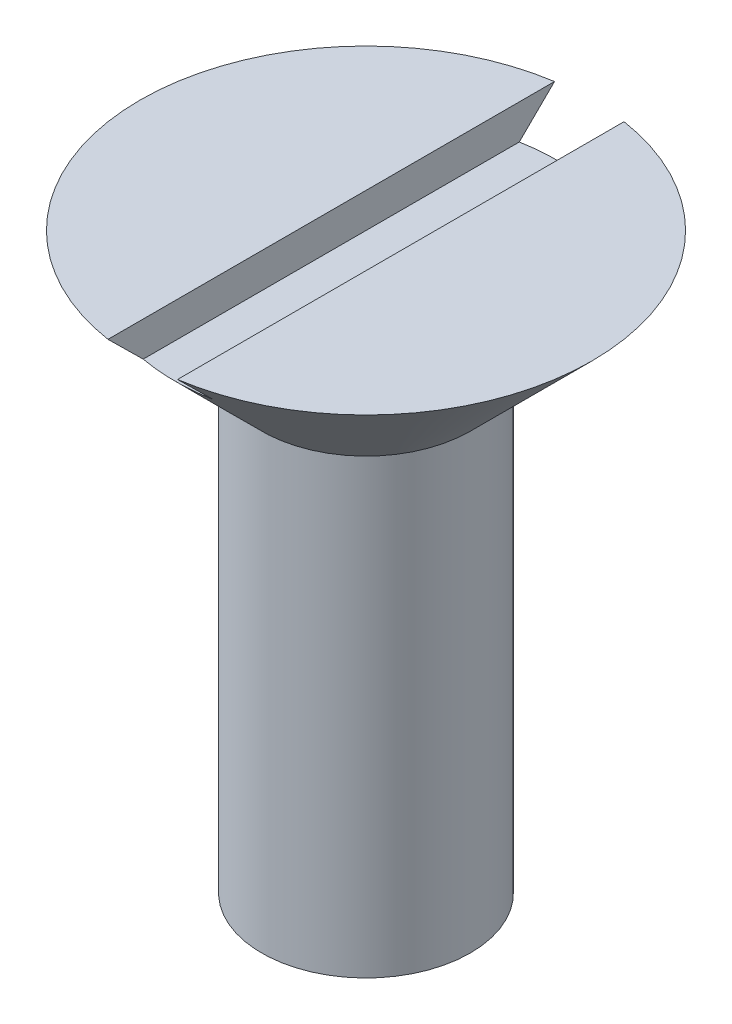
ISO-10303-21;
HEADER;
FILE_DESCRIPTION(('STEP AP214'),'2;1');
FILE_NAME('part.step','',(''),(''),'','','');
FILE_SCHEMA(('AUTOMOTIVE_DESIGN { 1 0 10303 214 1 1 1 1 }'));
ENDSEC;
DATA;
#1=APPLICATION_CONTEXT('core data for automotive mechanical design processes');
#2=APPLICATION_PROTOCOL_DEFINITION('international standard','automotive_design',2000,#1);
#3=PRODUCT_CONTEXT('',#1,'mechanical');
#4=PRODUCT('Part','Part','',(#3));
#5=PRODUCT_RELATED_PRODUCT_CATEGORY('part','',(#4));
#6=PRODUCT_DEFINITION_FORMATION('','',#4);
#7=PRODUCT_DEFINITION_CONTEXT('part definition',#1,'design');
#8=PRODUCT_DEFINITION('design','',#6,#7);
#9=PRODUCT_DEFINITION_SHAPE('','',#8);
#10=(LENGTH_UNIT() NAMED_UNIT(*) SI_UNIT(.MILLI.,.METRE.));
#11=(NAMED_UNIT(*) PLANE_ANGLE_UNIT() SI_UNIT($,.RADIAN.));
#12=(NAMED_UNIT(*) SI_UNIT($,.STERADIAN.) SOLID_ANGLE_UNIT());
#13=UNCERTAINTY_MEASURE_WITH_UNIT(LENGTH_MEASURE(1.E-05),#10,'distance_accuracy_value','');
#14=(GEOMETRIC_REPRESENTATION_CONTEXT(3) GLOBAL_UNCERTAINTY_ASSIGNED_CONTEXT((#13)) GLOBAL_UNIT_ASSIGNED_CONTEXT((#10,
#11,#12)) REPRESENTATION_CONTEXT('',''));
#15=CARTESIAN_POINT('',(0.,0.,0.));
#16=DIRECTION('',(0.,0.,1.));
#17=DIRECTION('',(1.,0.,0.));
#18=AXIS2_PLACEMENT_3D('',#15,#16,#17);
#19=CARTESIAN_POINT('',(0.,-1.23273041027252,0.));
#20=DIRECTION('',(0.,-1.,0.));
#21=DIRECTION('',(1.,0.,0.));
#22=AXIS2_PLACEMENT_3D('',#19,#20,#21);
#23=PLANE('',#22);
#24=CARTESIAN_POINT('',(0.,-1.23273041027252,0.));
#25=DIRECTION('',(0.,1.,0.));
#26=DIRECTION('',(-1.,0.,0.));
#27=AXIS2_PLACEMENT_3D('',#24,#25,#26);
#28=CIRCLE('',#27,6.5);
#29=CARTESIAN_POINT('',(1.,-1.23273041027252,6.42261628933256));
#30=VERTEX_POINT('',#29);
#31=CARTESIAN_POINT('',(1.,-1.23273041027252,-6.42261628933256));
#32=VERTEX_POINT('',#31);
#33=EDGE_CURVE('E139',#30,#32,#28,.T.);
#34=ORIENTED_EDGE('',*,*,#33,.T.);
#35=DIRECTION('',(0.,0.,1.));
#36=VECTOR('',#35,1.);
#37=CARTESIAN_POINT('',(1.,-1.23273041027252,0.));
#38=LINE('',#37,#36);
#39=EDGE_CURVE('E140',#32,#30,#38,.T.);
#40=ORIENTED_EDGE('',*,*,#39,.T.);
#41=EDGE_LOOP('',(#34,#40));
#42=FACE_BOUND('',#41,.T.);
#43=ADVANCED_FACE('F38',(#42),#23,.F.);
#44=CARTESIAN_POINT('',(0.,-19.4647812178413,0.));
#45=DIRECTION('',(0.,1.,0.));
#46=DIRECTION('',(-1.,0.,0.));
#47=AXIS2_PLACEMENT_3D('',#44,#45,#46);
#48=CONICAL_SURFACE('',#47,0.,1.0471975511966);
#49=CARTESIAN_POINT('',(0.,-17.7327304102725,0.));
#50=DIRECTION('',(0.,1.,0.));
#51=DIRECTION('',(-1.,0.,0.));
#52=AXIS2_PLACEMENT_3D('',#49,#50,#51);
#53=CIRCLE('',#52,3.);
#54=CARTESIAN_POINT('',(-3.,-17.7327304102725,0.));
#55=VERTEX_POINT('',#54);
#56=EDGE_CURVE('E144',#55,#55,#53,.T.);
#57=ORIENTED_EDGE('',*,*,#56,.F.);
#58=EDGE_LOOP('',(#57));
#59=FACE_BOUND('',#58,.T.);
#60=CARTESIAN_POINT('',(0.,-19.4647812178413,0.));
#61=VERTEX_POINT('',#60);
#62=VERTEX_LOOP('',#61);
#63=FACE_BOUND('',#62,.T.);
#64=ADVANCED_FACE('F40',(#59,#63),#48,.T.);
#65=CARTESIAN_POINT('',(0.,-1.23273041027252,0.));
#66=DIRECTION('',(0.,1.,0.));
#67=DIRECTION('',(-1.,0.,0.));
#68=AXIS2_PLACEMENT_3D('',#65,#66,#67);
#69=CYLINDRICAL_SURFACE('',#68,3.);
#70=CARTESIAN_POINT('',(0.,-4.73273041027248,0.));
#71=DIRECTION('',(0.,1.,0.));
#72=DIRECTION('',(-1.,0.,0.));
#73=AXIS2_PLACEMENT_3D('',#70,#71,#72);
#74=CIRCLE('',#73,3.);
#75=CARTESIAN_POINT('',(-3.,-4.73273041027248,0.));
#76=VERTEX_POINT('',#75);
#77=EDGE_CURVE('E142',#76,#76,#74,.T.);
#78=ORIENTED_EDGE('',*,*,#77,.F.);
#79=EDGE_LOOP('',(#78));
#80=FACE_BOUND('',#79,.T.);
#81=ORIENTED_EDGE('',*,*,#56,.T.);
#82=EDGE_LOOP('',(#81));
#83=FACE_BOUND('',#82,.T.);
#84=ADVANCED_FACE('F129',(#80,#83),#69,.T.);
#85=CARTESIAN_POINT('',(0.,-4.73273041027248,0.));
#86=DIRECTION('',(0.,1.,0.));
#87=DIRECTION('',(-1.,0.,0.));
#88=AXIS2_PLACEMENT_3D('',#85,#86,#87);
#89=CONICAL_SURFACE('',#88,3.,0.785398163397454);
#90=CARTESIAN_POINT('',(0.,-2.23273041027252,0.));
#91=DIRECTION('',(0.,-1.,0.));
#92=DIRECTION('',(1.,0.,0.));
#93=AXIS2_PLACEMENT_3D('',#90,#91,#92);
#94=CIRCLE('',#93,5.49999999999999);
#95=CARTESIAN_POINT('',(-1.,-2.23273041027252,-5.40832691319597));
#96=VERTEX_POINT('',#95);
#97=CARTESIAN_POINT('',(1.,-2.23273041027252,-5.40832691319597));
#98=VERTEX_POINT('',#97);
#99=EDGE_CURVE('E12',#96,#98,#94,.T.);
#100=ORIENTED_EDGE('',*,*,#99,.T.);
#101=CARTESIAN_POINT('',(1.,-1.23203041027252,6.42332472244709));
#102=CARTESIAN_POINT('',(1.,-1.41652290300337,6.23660097945427));
#103=CARTESIAN_POINT('',(1.,-1.60092767577466,6.04979042026792));
#104=CARTESIAN_POINT('',(1.,-1.96959774053552,5.67580075194415));
#105=CARTESIAN_POINT('',(1.,-2.15386287259467,5.48862148517341));
#106=CARTESIAN_POINT('',(1.,-2.52420929500072,5.11174427199789));
#107=CARTESIAN_POINT('',(1.,-2.71028664727953,4.92204245247595));
#108=CARTESIAN_POINT('',(1.,-3.08183888065866,4.54228085926048));
#109=CARTESIAN_POINT('',(1.,-3.26731406452049,4.35222138163071));
#110=CARTESIAN_POINT('',(1.,-3.71240463713502,3.89448779308014));
#111=CARTESIAN_POINT('',(1.,-3.97168834205481,3.62648996292632));
#112=CARTESIAN_POINT('',(1.,-4.3589862932474,3.22235847326328));
#113=CARTESIAN_POINT('',(1.,-4.48795598015954,3.08714155543484));
#114=CARTESIAN_POINT('',(1.,-4.74491391650076,2.81583986260068));
#115=CARTESIAN_POINT('',(1.,-4.87290239698009,2.67975530664802));
#116=CARTESIAN_POINT('',(1.,-5.12627373485783,2.40750996464743));
#117=CARTESIAN_POINT('',(1.,-5.25166973839294,2.27136147506034));
#118=CARTESIAN_POINT('',(1.,-5.43807896359134,2.06549251852143));
#119=CARTESIAN_POINT('',(1.,-5.4999636338604,1.99656195550247));
#120=CARTESIAN_POINT('',(1.,-5.62295105751671,1.85800765522077));
#121=CARTESIAN_POINT('',(1.,-5.68405382729665,1.78838393254485));
#122=CARTESIAN_POINT('',(1.,-5.80495538868522,1.6484994482769));
#123=CARTESIAN_POINT('',(1.,-5.86475843522965,1.57824237330105));
#124=CARTESIAN_POINT('',(1.,-5.98287992571606,1.43649465507043));
#125=CARTESIAN_POINT('',(1.,-6.04119851200688,1.36500413120582));
#126=CARTESIAN_POINT('',(1.,-6.15557355759967,1.22040224759312));
#127=CARTESIAN_POINT('',(1.,-6.21163324500897,1.14729345020522));
#128=CARTESIAN_POINT('',(1.,-6.32039900730695,0.998633654183092));
#129=CARTESIAN_POINT('',(1.,-6.37310711050668,0.923084175167162));
#130=CARTESIAN_POINT('',(1.,-6.43531671875435,0.826733268002374));
#131=CARTESIAN_POINT('',(1.,-6.44742412999684,0.807613449628495));
#132=CARTESIAN_POINT('',(1.,-6.47125047956801,0.769130032509394));
#133=CARTESIAN_POINT('',(1.,-6.48296936765064,0.749766402676425));
#134=CARTESIAN_POINT('',(1.,-6.51746454090023,0.691277443855427));
#135=CARTESIAN_POINT('',(1.,-6.53957805134024,0.651756012110397));
#136=CARTESIAN_POINT('',(1.,-6.58129772281274,0.57179583646021));
#137=CARTESIAN_POINT('',(1.,-6.60092246148191,0.531366913059408));
#138=CARTESIAN_POINT('',(1.,-6.63710892258034,0.449164527118054));
#139=CARTESIAN_POINT('',(1.,-6.65367157340716,0.407391476629303));
#140=CARTESIAN_POINT('',(1.,-6.68820449817153,0.306630339616175));
#141=CARTESIAN_POINT('',(1.,-6.70441608363833,0.24700670038358));
#142=CARTESIAN_POINT('',(1.,-6.72655912176547,0.125997310764444));
#143=CARTESIAN_POINT('',(1.,-6.73252824716476,0.06461886569502));
#144=CARTESIAN_POINT('',(1.,-6.73292292890544,-0.0584045004398529));
#145=CARTESIAN_POINT('',(1.,-6.72730632242692,-0.1200495772222));
#146=CARTESIAN_POINT('',(1.,-6.70572091595079,-0.241594604406596));
#147=CARTESIAN_POINT('',(1.,-6.68971691800243,-0.301487895031297));
#148=CARTESIAN_POINT('',(1.,-6.64848496634865,-0.423255248595611));
#149=CARTESIAN_POINT('',(1.,-6.6226217895104,-0.484904761598903));
#150=CARTESIAN_POINT('',(1.,-6.56495097472921,-0.605404375291112));
#151=CARTESIAN_POINT('',(1.,-6.53313194161959,-0.664248833759943));
#152=CARTESIAN_POINT('',(1.,-6.46533146994867,-0.780076722377074));
#153=CARTESIAN_POINT('',(1.,-6.42931904780031,-0.837041711978605));
#154=CARTESIAN_POINT('',(1.,-6.3733152044274,-0.921108655798651));
#155=CARTESIAN_POINT('',(1.,-6.35432481755244,-0.94888945147057));
#156=CARTESIAN_POINT('',(1.,-6.31578210479641,-1.00405791508456));
#157=CARTESIAN_POINT('',(1.,-6.29622979513275,-1.03144559433807));
#158=CARTESIAN_POINT('',(1.,-6.23320744697192,-1.11814350022168));
#159=CARTESIAN_POINT('',(1.,-6.1888574220853,-1.17681365371053));
#160=CARTESIAN_POINT('',(1.,-6.09859877903792,-1.29294612386859));
#161=CARTESIAN_POINT('',(1.,-6.05268992011472,-1.35040825171831));
#162=CARTESIAN_POINT('',(1.,-5.91325346599664,-1.52148386035261));
#163=CARTESIAN_POINT('',(1.,-5.81805623924538,-1.63373305297759));
#164=CARTESIAN_POINT('',(1.,-5.62499054006917,-1.85622604953625));
#165=CARTESIAN_POINT('',(1.,-5.5271176863933,-1.96646600221255));
#166=CARTESIAN_POINT('',(1.,-5.32980484484801,-2.18547633450575));
#167=CARTESIAN_POINT('',(1.,-5.23036530311115,-2.29424711666668));
#168=CARTESIAN_POINT('',(1.,-5.03076191019596,-2.51044729255318));
#169=CARTESIAN_POINT('',(1.,-4.93060158375438,-2.61787995144487));
#170=CARTESIAN_POINT('',(1.,-4.72953329045203,-2.83205668510772));
#171=CARTESIAN_POINT('',(1.,-4.62862527175303,-2.93880071115715));
#172=CARTESIAN_POINT('',(1.,-4.32529946596139,-3.25807348248427));
#173=CARTESIAN_POINT('',(1.,-4.12208877139924,-3.46984818145712));
#174=CARTESIAN_POINT('',(1.,-3.6961791900289,-3.91117980862671));
#175=CARTESIAN_POINT('',(1.,-3.47336750982194,-4.1406275516051));
#176=CARTESIAN_POINT('',(1.,-3.0267954831004,-4.59874114188873));
#177=CARTESIAN_POINT('',(1.,-2.80303485486957,-4.82740671438632));
#178=CARTESIAN_POINT('',(1.,-2.35491893435839,-5.28420548161051));
#179=CARTESIAN_POINT('',(1.,-2.13056357670853,-5.51233861215162));
#180=CARTESIAN_POINT('',(1.,-1.68152248668073,-5.96812929258627));
#181=CARTESIAN_POINT('',(1.,-1.45683688985977,-6.19578697599766));
#182=CARTESIAN_POINT('',(1.,-1.23203041027252,-6.42332472244709));
#183=B_SPLINE_CURVE_WITH_KNOTS('',3,(#101,#102,#103,#104,#105,#106,#107,#108,#109,#110,#111,
#112,#113,#114,#115,#116,#117,#118,#119,#120,#121,#122,#123,#124,#125,#126,#127,#128,#129,#130,
#131,#132,#133,#134,#135,#136,#137,#138,#139,#140,#141,#142,#143,#144,#145,#146,#147,#148,#149,
#150,#151,#152,#153,#154,#155,#156,#157,#158,#159,#160,#161,#162,#163,#164,#165,#166,#167,#168,
#169,#170,#171,#172,#173,#174,#175,#176,#177,#178,#179,#180,#181,#182),.UNSPECIFIED.,.F.,.F.,(4,
2,2,2,2,2,2,2,2,2,2,2,2,2,2,2,2,2,2,2,2,2,2,2,2,2,2,2,2,2,2,2,2,2,2,2,2,2,2,2,4),(0.,
0.787482879091082,1.57545946982072,2.37264371237516,3.16933207457059,4.2880067299783,
4.84858456810994,5.40902607813934,5.96429483881581,6.24219393443099,6.52008719426127,
6.79686319025389,7.07361254470392,7.3499512636095,7.6261211242439,7.69400967717522,
7.76190697586418,7.8977086128613,8.0324279907232,8.16710645565276,8.35176568840783,
8.53574425942201,8.72039354672398,8.90567181282051,9.10576489619661,9.30624479924503,
9.50831322811276,9.60926230610502,9.71020847356947,9.93080591781799,10.1514375897978,
10.5929016423222,11.0351379005565,11.4772504248661,11.9178874921873,12.3585554006098,
13.2390498022863,14.1985373102663,15.1583329960949,16.1182389566303,17.077823941592),.UNSPECIFIED.);
#184=EDGE_CURVE('E96',#98,#32,#183,.T.);
#185=ORIENTED_EDGE('',*,*,#184,.T.);
#186=ORIENTED_EDGE('',*,*,#33,.F.);
#187=CARTESIAN_POINT('',(1.,-2.23273041027252,5.40832691319597));
#188=VERTEX_POINT('',#187);
#189=EDGE_CURVE('E98',#30,#188,#183,.T.);
#190=ORIENTED_EDGE('',*,*,#189,.T.);
#191=CARTESIAN_POINT('',(-1.,-2.23273041027252,5.40832691319597));
#192=VERTEX_POINT('',#191);
#193=EDGE_CURVE('E42',#188,#192,#94,.T.);
#194=ORIENTED_EDGE('',*,*,#193,.T.);
#195=CARTESIAN_POINT('',(-1.,-1.23203041027252,-6.42332472244709));
#196=CARTESIAN_POINT('',(-1.,-1.41652290300337,-6.23660097945427));
#197=CARTESIAN_POINT('',(-1.,-1.60092767577466,-6.04979042026792));
#198=CARTESIAN_POINT('',(-1.,-1.96959774053551,-5.67580075194415));
#199=CARTESIAN_POINT('',(-1.,-2.15386287259466,-5.48862148517342));
#200=CARTESIAN_POINT('',(-1.,-2.52420929500072,-5.1117442719979));
#201=CARTESIAN_POINT('',(-1.,-2.71028664727952,-4.92204245247596));
#202=CARTESIAN_POINT('',(-1.,-3.08183888065865,-4.54228085926049));
#203=CARTESIAN_POINT('',(-1.,-3.26731406452048,-4.35222138163072));
#204=CARTESIAN_POINT('',(-1.,-3.71240463713501,-3.89448779308015));
#205=CARTESIAN_POINT('',(-1.,-3.9716883420548,-3.62648996292633));
#206=CARTESIAN_POINT('',(-1.,-4.35898629324739,-3.22235847326328));
#207=CARTESIAN_POINT('',(-1.,-4.48795598015954,-3.08714155543485));
#208=CARTESIAN_POINT('',(-1.,-4.74491391650075,-2.81583986260069));
#209=CARTESIAN_POINT('',(-1.,-4.87290239698008,-2.67975530664803));
#210=CARTESIAN_POINT('',(-1.,-5.12627373485783,-2.40750996464744));
#211=CARTESIAN_POINT('',(-1.,-5.25166973839293,-2.27136147506034));
#212=CARTESIAN_POINT('',(-1.,-5.43807896359134,-2.06549251852143));
#213=CARTESIAN_POINT('',(-1.,-5.4999636338604,-1.99656195550247));
#214=CARTESIAN_POINT('',(-1.,-5.6229510575167,-1.85800765522077));
#215=CARTESIAN_POINT('',(-1.,-5.68405382729665,-1.78838393254485));
#216=CARTESIAN_POINT('',(-1.,-5.80495538868522,-1.6484994482769));
#217=CARTESIAN_POINT('',(-1.,-5.86475843522966,-1.57824237330105));
#218=CARTESIAN_POINT('',(-1.,-5.98287992571606,-1.43649465507043));
#219=CARTESIAN_POINT('',(-1.,-6.04119851200688,-1.36500413120582));
#220=CARTESIAN_POINT('',(-1.,-6.15557355759967,-1.22040224759312));
#221=CARTESIAN_POINT('',(-1.,-6.21163324500897,-1.14729345020522));
#222=CARTESIAN_POINT('',(-1.,-6.32039900730696,-0.998633654183092));
#223=CARTESIAN_POINT('',(-1.,-6.37310711050668,-0.923084175167162));
#224=CARTESIAN_POINT('',(-1.,-6.43531671875435,-0.826733268002373));
#225=CARTESIAN_POINT('',(-1.,-6.44742412999684,-0.807613449628494));
#226=CARTESIAN_POINT('',(-1.,-6.47125047956801,-0.769130032509394));
#227=CARTESIAN_POINT('',(-1.,-6.48296936765064,-0.749766402676424));
#228=CARTESIAN_POINT('',(-1.,-6.51746454090023,-0.691277443855426));
#229=CARTESIAN_POINT('',(-1.,-6.53957805134024,-0.651756012110397));
#230=CARTESIAN_POINT('',(-1.,-6.58129772281274,-0.57179583646021));
#231=CARTESIAN_POINT('',(-1.,-6.60092246148191,-0.531366913059407));
#232=CARTESIAN_POINT('',(-1.,-6.63710892258034,-0.449164527118054));
#233=CARTESIAN_POINT('',(-1.,-6.65367157340716,-0.407391476629303));
#234=CARTESIAN_POINT('',(-1.,-6.68820449817153,-0.306630339616176));
#235=CARTESIAN_POINT('',(-1.,-6.70441608363833,-0.247006700383581));
#236=CARTESIAN_POINT('',(-1.,-6.72655912176547,-0.125997310764445));
#237=CARTESIAN_POINT('',(-1.,-6.73252824716476,-0.0646188656950203));
#238=CARTESIAN_POINT('',(-1.,-6.73292292890544,0.0584045004398536));
#239=CARTESIAN_POINT('',(-1.,-6.72730632242692,0.120049577222201));
#240=CARTESIAN_POINT('',(-1.,-6.70572091595079,0.241594604406597));
#241=CARTESIAN_POINT('',(-1.,-6.68971691800243,0.301487895031297));
#242=CARTESIAN_POINT('',(-1.,-6.64848496634865,0.42325524859561));
#243=CARTESIAN_POINT('',(-1.,-6.6226217895104,0.484904761598902));
#244=CARTESIAN_POINT('',(-1.,-6.56495097472921,0.60540437529111));
#245=CARTESIAN_POINT('',(-1.,-6.5331319416196,0.664248833759941));
#246=CARTESIAN_POINT('',(-1.,-6.46533146994867,0.780076722377071));
#247=CARTESIAN_POINT('',(-1.,-6.42931904780031,0.837041711978603));
#248=CARTESIAN_POINT('',(-1.,-6.37331520442741,0.921108655798649));
#249=CARTESIAN_POINT('',(-1.,-6.35432481755245,0.948889451470568));
#250=CARTESIAN_POINT('',(-1.,-6.31578210479641,1.00405791508456));
#251=CARTESIAN_POINT('',(-1.,-6.29622979513275,1.03144559433807));
#252=CARTESIAN_POINT('',(-1.,-6.23320744697192,1.11814350022168));
#253=CARTESIAN_POINT('',(-1.,-6.1888574220853,1.17681365371053));
#254=CARTESIAN_POINT('',(-1.,-6.09859877903792,1.29294612386859));
#255=CARTESIAN_POINT('',(-1.,-6.05268992011472,1.35040825171831));
#256=CARTESIAN_POINT('',(-1.,-5.91325346599664,1.52148386035261));
#257=CARTESIAN_POINT('',(-1.,-5.81805623924538,1.63373305297759));
#258=CARTESIAN_POINT('',(-1.,-5.62499054006917,1.85622604953625));
#259=CARTESIAN_POINT('',(-1.,-5.5271176863933,1.96646600221255));
#260=CARTESIAN_POINT('',(-1.,-5.32980484484801,2.18547633450575));
#261=CARTESIAN_POINT('',(-1.,-5.23036530311115,2.29424711666669));
#262=CARTESIAN_POINT('',(-1.,-5.03076191019596,2.51044729255318));
#263=CARTESIAN_POINT('',(-1.,-4.93060158375438,2.61787995144487));
#264=CARTESIAN_POINT('',(-1.,-4.72953329045203,2.83205668510772));
#265=CARTESIAN_POINT('',(-1.,-4.62862527175303,2.93880071115715));
#266=CARTESIAN_POINT('',(-1.,-4.32529946596139,3.25807348248427));
#267=CARTESIAN_POINT('',(-1.,-4.12208877139924,3.46984818145712));
#268=CARTESIAN_POINT('',(-1.,-3.6961791900289,3.91117980862671));
#269=CARTESIAN_POINT('',(-1.,-3.47336750982194,4.1406275516051));
#270=CARTESIAN_POINT('',(-1.,-3.0267954831004,4.59874114188873));
#271=CARTESIAN_POINT('',(-1.,-2.80303485486957,4.82740671438632));
#272=CARTESIAN_POINT('',(-1.,-2.35491893435839,5.28420548161051));
#273=CARTESIAN_POINT('',(-1.,-2.13056357670853,5.51233861215161));
#274=CARTESIAN_POINT('',(-1.,-1.68152248668073,5.96812929258626));
#275=CARTESIAN_POINT('',(-1.,-1.45683688985977,6.19578697599766));
#276=CARTESIAN_POINT('',(-1.,-1.23203041027252,6.42332472244709));
#277=B_SPLINE_CURVE_WITH_KNOTS('',3,(#195,#196,#197,#198,#199,#200,#201,#202,#203,#204,#205,
#206,#207,#208,#209,#210,#211,#212,#213,#214,#215,#216,#217,#218,#219,#220,#221,#222,#223,#224,
#225,#226,#227,#228,#229,#230,#231,#232,#233,#234,#235,#236,#237,#238,#239,#240,#241,#242,#243,
#244,#245,#246,#247,#248,#249,#250,#251,#252,#253,#254,#255,#256,#257,#258,#259,#260,#261,#262,
#263,#264,#265,#266,#267,#268,#269,#270,#271,#272,#273,#274,#275,#276),.UNSPECIFIED.,.F.,.F.,(4,
2,2,2,2,2,2,2,2,2,2,2,2,2,2,2,2,2,2,2,2,2,2,2,2,2,2,2,2,2,2,2,2,2,2,2,2,2,2,2,4),(0.,
0.78748287909108,1.57545946982071,2.37264371237515,3.16933207457058,4.28800672997829,
4.84858456810993,5.40902607813933,5.9642948388158,6.24219393443099,6.52008719426127,
6.79686319025389,7.07361254470392,7.3499512636095,7.6261211242439,7.69400967717522,
7.76190697586418,7.89770861286129,8.0324279907232,8.16710645565276,8.35176568840783,
8.53574425942201,8.72039354672398,8.9056718128205,9.1057648961966,9.30624479924502,
9.50831322811275,9.60926230610501,9.71020847356946,9.93080591781798,10.1514375897978,
10.5929016423222,11.0351379005565,11.4772504248661,11.9178874921873,12.3585554006098,
13.2390498022863,14.1985373102663,15.1583329960949,16.1182389566303,17.077823941592),.UNSPECIFIED.);
#278=CARTESIAN_POINT('',(-1.,-1.23273041027252,6.42261628933256));
#279=VERTEX_POINT('',#278);
#280=EDGE_CURVE('E89',#192,#279,#277,.T.);
#281=ORIENTED_EDGE('',*,*,#280,.T.);
#282=CARTESIAN_POINT('',(-1.,-1.23273041027252,-6.42261628933256));
#283=VERTEX_POINT('',#282);
#284=EDGE_CURVE('E95',#283,#279,#28,.T.);
#285=ORIENTED_EDGE('',*,*,#284,.F.);
#286=EDGE_CURVE('E53',#283,#96,#277,.T.);
#287=ORIENTED_EDGE('',*,*,#286,.T.);
#288=EDGE_LOOP('',(#100,#185,#186,#190,#194,#281,#285,#287));
#289=FACE_BOUND('',#288,.T.);
#290=ORIENTED_EDGE('',*,*,#77,.T.);
#291=EDGE_LOOP('',(#290));
#292=FACE_BOUND('',#291,.T.);
#293=ADVANCED_FACE('F92',(#289,#292),#89,.T.);
#294=ORIENTED_EDGE('',*,*,#284,.T.);
#295=DIRECTION('',(0.,0.,-1.));
#296=VECTOR('',#295,1.);
#297=CARTESIAN_POINT('',(-1.,-1.23273041027252,0.));
#298=LINE('',#297,#296);
#299=EDGE_CURVE('E149',#279,#283,#298,.T.);
#300=ORIENTED_EDGE('',*,*,#299,.T.);
#301=EDGE_LOOP('',(#294,#300));
#302=FACE_BOUND('',#301,.T.);
#303=ADVANCED_FACE('F122',(#302),#23,.F.);
#304=CARTESIAN_POINT('',(-1.,-2.23273041027252,-15.));
#305=DIRECTION('',(0.,-1.,0.));
#306=DIRECTION('',(1.,0.,0.));
#307=AXIS2_PLACEMENT_3D('',#304,#305,#306);
#308=PLANE('',#307);
#309=DIRECTION('',(0.,0.,1.));
#310=VECTOR('',#309,1.);
#311=CARTESIAN_POINT('',(1.,-2.23273041027252,-15.));
#312=LINE('',#311,#310);
#313=EDGE_CURVE('E84',#98,#188,#312,.T.);
#314=ORIENTED_EDGE('',*,*,#313,.F.);
#315=ORIENTED_EDGE('',*,*,#99,.F.);
#316=DIRECTION('',(0.,0.,1.));
#317=VECTOR('',#316,1.);
#318=CARTESIAN_POINT('',(-1.,-2.23273041027252,-15.));
#319=LINE('',#318,#317);
#320=EDGE_CURVE('E81',#96,#192,#319,.T.);
#321=ORIENTED_EDGE('',*,*,#320,.T.);
#322=ORIENTED_EDGE('',*,*,#193,.F.);
#323=EDGE_LOOP('',(#314,#315,#321,#322));
#324=FACE_BOUND('',#323,.T.);
#325=ADVANCED_FACE('F80',(#324),#308,.F.);
#326=CARTESIAN_POINT('',(1.,-0.232730410272518,-15.));
#327=DIRECTION('',(1.,0.,0.));
#328=DIRECTION('',(0.,1.,0.));
#329=AXIS2_PLACEMENT_3D('',#326,#327,#328);
#330=PLANE('',#329);
#331=ORIENTED_EDGE('',*,*,#39,.F.);
#332=ORIENTED_EDGE('',*,*,#184,.F.);
#333=ORIENTED_EDGE('',*,*,#313,.T.);
#334=ORIENTED_EDGE('',*,*,#189,.F.);
#335=EDGE_LOOP('',(#331,#332,#333,#334));
#336=FACE_BOUND('',#335,.T.);
#337=ADVANCED_FACE('F118',(#336),#330,.F.);
#338=CARTESIAN_POINT('',(-1.,-0.232730410272519,-15.));
#339=DIRECTION('',(-1.,0.,0.));
#340=DIRECTION('',(0.,-1.,0.));
#341=AXIS2_PLACEMENT_3D('',#338,#339,#340);
#342=PLANE('',#341);
#343=ORIENTED_EDGE('',*,*,#299,.F.);
#344=ORIENTED_EDGE('',*,*,#280,.F.);
#345=ORIENTED_EDGE('',*,*,#320,.F.);
#346=ORIENTED_EDGE('',*,*,#286,.F.);
#347=EDGE_LOOP('',(#343,#344,#345,#346));
#348=FACE_BOUND('',#347,.T.);
#349=ADVANCED_FACE('F87',(#348),#342,.F.);
#350=CLOSED_SHELL('',(#43,#64,#84,#293,#303,#325,#337,#349));
#351=MANIFOLD_SOLID_BREP('B2',#350);
#352=ADVANCED_BREP_SHAPE_REPRESENTATION('',(#18,#351),#14);
#353=SHAPE_DEFINITION_REPRESENTATION(#9,#352);
ENDSEC;
END-ISO-10303-21;
